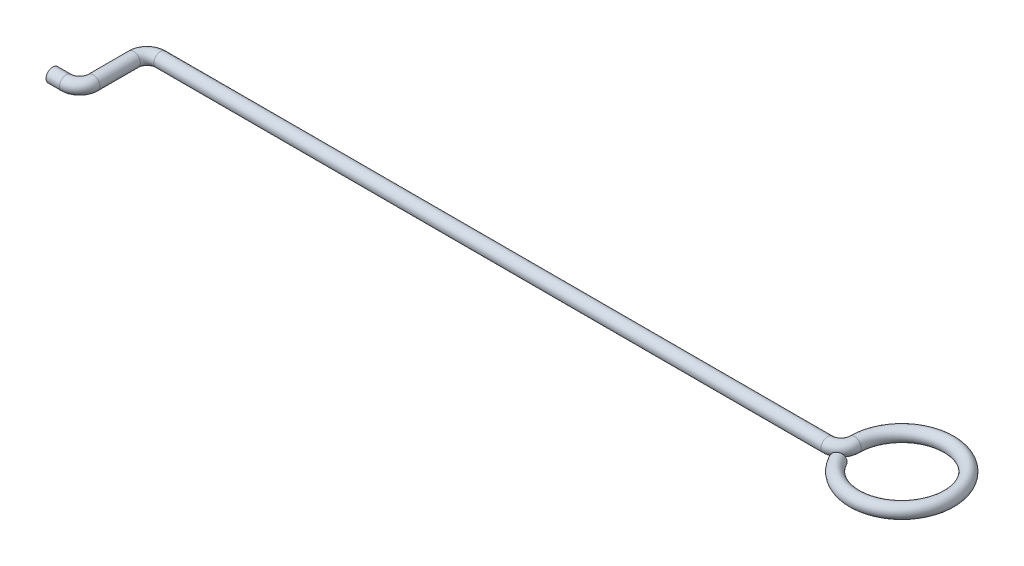
ISO-10303-21;
HEADER;
FILE_DESCRIPTION(('STEP AP214'),'2;1');
FILE_NAME('part.step','',(''),(''),'','','');
FILE_SCHEMA(('AUTOMOTIVE_DESIGN { 1 0 10303 214 1 1 1 1 }'));
ENDSEC;
DATA;
#1=APPLICATION_CONTEXT('core data for automotive mechanical design processes');
#2=APPLICATION_PROTOCOL_DEFINITION('international standard','automotive_design',2000,#1);
#3=PRODUCT_CONTEXT('',#1,'mechanical');
#4=PRODUCT('Part','Part','',(#3));
#5=PRODUCT_RELATED_PRODUCT_CATEGORY('part','',(#4));
#6=PRODUCT_DEFINITION_FORMATION('','',#4);
#7=PRODUCT_DEFINITION_CONTEXT('part definition',#1,'design');
#8=PRODUCT_DEFINITION('design','',#6,#7);
#9=PRODUCT_DEFINITION_SHAPE('','',#8);
#10=(LENGTH_UNIT() NAMED_UNIT(*) SI_UNIT(.MILLI.,.METRE.));
#11=(NAMED_UNIT(*) PLANE_ANGLE_UNIT() SI_UNIT($,.RADIAN.));
#12=(NAMED_UNIT(*) SI_UNIT($,.STERADIAN.) SOLID_ANGLE_UNIT());
#13=UNCERTAINTY_MEASURE_WITH_UNIT(LENGTH_MEASURE(1.E-05),#10,'distance_accuracy_value','');
#14=(GEOMETRIC_REPRESENTATION_CONTEXT(3) GLOBAL_UNCERTAINTY_ASSIGNED_CONTEXT((#13)) GLOBAL_UNIT_ASSIGNED_CONTEXT((#10,
#11,#12)) REPRESENTATION_CONTEXT('',''));
#15=CARTESIAN_POINT('',(0.,0.,0.));
#16=DIRECTION('',(0.,0.,1.));
#17=DIRECTION('',(1.,0.,0.));
#18=AXIS2_PLACEMENT_3D('',#15,#16,#17);
#19=CARTESIAN_POINT('',(57.,0.,-6.));
#20=DIRECTION('',(0.,-1.,0.));
#21=DIRECTION('',(0.,0.,-1.));
#22=AXIS2_PLACEMENT_3D('',#19,#20,#21);
#23=TOROIDAL_SURFACE('',#22,3.50000000000003,0.5);
#24=CARTESIAN_POINT('',(53.5,0.,-6.));
#25=DIRECTION('',(0.,0.,-1.));
#26=DIRECTION('',(-1.,0.,0.));
#27=AXIS2_PLACEMENT_3D('',#24,#25,#26);
#28=CIRCLE('',#27,0.5);
#29=CARTESIAN_POINT('',(53.,0.,-6.));
#30=VERTEX_POINT('',#29);
#31=EDGE_CURVE('E37',#30,#30,#28,.T.);
#32=CARTESIAN_POINT('',(53.9053063523168,0.,-4.36510819104454));
#33=DIRECTION('',(-0.467111945415842,0.,-0.884198185052326));
#34=DIRECTION('',(-0.884198185052326,0.,0.467111945415842));
#35=AXIS2_PLACEMENT_3D('',#32,#33,#34);
#36=CIRCLE('',#35,0.5);
#37=CARTESIAN_POINT('',(53.4632072597907,0.,-4.13155221833662));
#38=VERTEX_POINT('',#37);
#39=EDGE_CURVE('E10',#38,#38,#36,.T.);
#40=CARTESIAN_POINT('',(57.,0.,-6.));
#41=DIRECTION('',(0.,-1.,0.));
#42=DIRECTION('',(0.,0.,-1.));
#43=AXIS2_PLACEMENT_3D('',#40,#41,#42);
#44=CIRCLE('',#43,4.00000000000003);
#45=EDGE_CURVE('',#30,#38,#44,.T.);
#46=ORIENTED_EDGE('',*,*,#31,.T.);
#47=ORIENTED_EDGE('',*,*,#39,.F.);
#48=ORIENTED_EDGE('',*,*,#45,.T.);
#49=ORIENTED_EDGE('',*,*,#45,.F.);
#50=EDGE_LOOP('',(#46,#48,#47,#49));
#51=FACE_BOUND('',#50,.T.);
#52=ADVANCED_FACE('F31',(#51),#23,.T.);
#53=CARTESIAN_POINT('',(52.5,0.,-6.));
#54=DIRECTION('',(0.,1.,0.));
#55=DIRECTION('',(0.,0.,1.));
#56=AXIS2_PLACEMENT_3D('',#53,#54,#55);
#57=TOROIDAL_SURFACE('',#56,1.,0.5);
#58=CARTESIAN_POINT('',(52.5,0.,-5.));
#59=DIRECTION('',(1.,0.,0.));
#60=DIRECTION('',(0.,0.,-1.));
#61=AXIS2_PLACEMENT_3D('',#58,#59,#60);
#62=CIRCLE('',#61,0.5);
#63=CARTESIAN_POINT('',(52.5,0.,-5.5));
#64=VERTEX_POINT('',#63);
#65=EDGE_CURVE('E41',#64,#64,#62,.T.);
#66=ORIENTED_EDGE('',*,*,#65,.T.);
#67=EDGE_LOOP('',(#66));
#68=FACE_BOUND('',#67,.T.);
#69=ORIENTED_EDGE('',*,*,#31,.F.);
#70=EDGE_LOOP('',(#69));
#71=FACE_BOUND('',#70,.T.);
#72=ADVANCED_FACE('F81',(#68,#71),#57,.T.);
#73=CARTESIAN_POINT('',(3.,0.,-5.));
#74=DIRECTION('',(1.,0.,0.));
#75=DIRECTION('',(0.,0.,-1.));
#76=AXIS2_PLACEMENT_3D('',#73,#74,#75);
#77=CYLINDRICAL_SURFACE('',#76,0.5);
#78=CARTESIAN_POINT('',(3.,0.,-5.));
#79=DIRECTION('',(1.,0.,0.));
#80=DIRECTION('',(0.,0.,-1.));
#81=AXIS2_PLACEMENT_3D('',#78,#79,#80);
#82=CIRCLE('',#81,0.5);
#83=CARTESIAN_POINT('',(3.,0.,-5.5));
#84=VERTEX_POINT('',#83);
#85=EDGE_CURVE('E45',#84,#84,#82,.T.);
#86=ORIENTED_EDGE('',*,*,#85,.T.);
#87=EDGE_LOOP('',(#86));
#88=FACE_BOUND('',#87,.T.);
#89=ORIENTED_EDGE('',*,*,#65,.F.);
#90=EDGE_LOOP('',(#89));
#91=FACE_BOUND('',#90,.T.);
#92=ADVANCED_FACE('F85',(#88,#91),#77,.T.);
#93=CARTESIAN_POINT('',(3.,0.,-4.));
#94=DIRECTION('',(0.,-1.,0.));
#95=DIRECTION('',(0.,0.,-1.));
#96=AXIS2_PLACEMENT_3D('',#93,#94,#95);
#97=TOROIDAL_SURFACE('',#96,1.,0.5);
#98=CARTESIAN_POINT('',(2.,0.,-4.));
#99=DIRECTION('',(0.,0.,-1.));
#100=DIRECTION('',(-1.,0.,0.));
#101=AXIS2_PLACEMENT_3D('',#98,#99,#100);
#102=CIRCLE('',#101,0.5);
#103=CARTESIAN_POINT('',(1.5,0.,-4.));
#104=VERTEX_POINT('',#103);
#105=EDGE_CURVE('E50',#104,#104,#102,.T.);
#106=CARTESIAN_POINT('',(3.,0.,-4.));
#107=DIRECTION('',(0.,-1.,0.));
#108=DIRECTION('',(0.,0.,-1.));
#109=AXIS2_PLACEMENT_3D('',#106,#107,#108);
#110=CIRCLE('',#109,1.5);
#111=EDGE_CURVE('',#104,#84,#110,.T.);
#112=ORIENTED_EDGE('',*,*,#105,.T.);
#113=ORIENTED_EDGE('',*,*,#85,.F.);
#114=ORIENTED_EDGE('',*,*,#111,.T.);
#115=ORIENTED_EDGE('',*,*,#111,.F.);
#116=EDGE_LOOP('',(#112,#114,#113,#115));
#117=FACE_BOUND('',#116,.T.);
#118=ADVANCED_FACE('F91',(#117),#97,.T.);
#119=CARTESIAN_POINT('',(2.,0.,-1.));
#120=DIRECTION('',(0.,0.,-1.));
#121=DIRECTION('',(-1.,0.,0.));
#122=AXIS2_PLACEMENT_3D('',#119,#120,#121);
#123=CYLINDRICAL_SURFACE('',#122,0.5);
#124=CARTESIAN_POINT('',(2.,0.,-1.));
#125=DIRECTION('',(0.,0.,-1.));
#126=DIRECTION('',(-1.,0.,0.));
#127=AXIS2_PLACEMENT_3D('',#124,#125,#126);
#128=CIRCLE('',#127,0.5);
#129=CARTESIAN_POINT('',(2.5,0.,-1.));
#130=VERTEX_POINT('',#129);
#131=EDGE_CURVE('E53',#130,#130,#128,.T.);
#132=ORIENTED_EDGE('',*,*,#131,.T.);
#133=EDGE_LOOP('',(#132));
#134=FACE_BOUND('',#133,.T.);
#135=ORIENTED_EDGE('',*,*,#105,.F.);
#136=EDGE_LOOP('',(#135));
#137=FACE_BOUND('',#136,.T.);
#138=ADVANCED_FACE('F98',(#134,#137),#123,.T.);
#139=CARTESIAN_POINT('',(1.,0.,-1.));
#140=DIRECTION('',(0.,1.,0.));
#141=DIRECTION('',(0.,0.,1.));
#142=AXIS2_PLACEMENT_3D('',#139,#140,#141);
#143=TOROIDAL_SURFACE('',#142,1.,0.5);
#144=CARTESIAN_POINT('',(1.,0.,0.));
#145=DIRECTION('',(1.,0.,0.));
#146=DIRECTION('',(0.,0.,-1.));
#147=AXIS2_PLACEMENT_3D('',#144,#145,#146);
#148=CIRCLE('',#147,0.5);
#149=CARTESIAN_POINT('',(1.,0.,0.5));
#150=VERTEX_POINT('',#149);
#151=EDGE_CURVE('E56',#150,#150,#148,.T.);
#152=CARTESIAN_POINT('',(1.,0.,-1.));
#153=DIRECTION('',(0.,1.,0.));
#154=DIRECTION('',(0.,0.,1.));
#155=AXIS2_PLACEMENT_3D('',#152,#153,#154);
#156=CIRCLE('',#155,1.5);
#157=EDGE_CURVE('',#150,#130,#156,.T.);
#158=ORIENTED_EDGE('',*,*,#151,.T.);
#159=ORIENTED_EDGE('',*,*,#131,.F.);
#160=ORIENTED_EDGE('',*,*,#157,.T.);
#161=ORIENTED_EDGE('',*,*,#157,.F.);
#162=EDGE_LOOP('',(#158,#160,#159,#161));
#163=FACE_BOUND('',#162,.T.);
#164=ADVANCED_FACE('F63',(#163),#143,.T.);
#165=CARTESIAN_POINT('',(1.,0.,0.));
#166=DIRECTION('',(-1.,0.,0.));
#167=DIRECTION('',(0.,0.,1.));
#168=AXIS2_PLACEMENT_3D('',#165,#166,#167);
#169=CYLINDRICAL_SURFACE('',#168,0.5);
#170=ORIENTED_EDGE('',*,*,#151,.F.);
#171=EDGE_LOOP('',(#170));
#172=FACE_BOUND('',#171,.T.);
#173=CARTESIAN_POINT('',(0.,0.,0.));
#174=DIRECTION('',(1.,0.,0.));
#175=DIRECTION('',(0.,0.,-1.));
#176=AXIS2_PLACEMENT_3D('',#173,#174,#175);
#177=CIRCLE('',#176,0.5);
#178=CARTESIAN_POINT('',(0.,0.,-0.5));
#179=VERTEX_POINT('',#178);
#180=EDGE_CURVE('E57',#179,#179,#177,.T.);
#181=ORIENTED_EDGE('',*,*,#180,.T.);
#182=EDGE_LOOP('',(#181));
#183=FACE_BOUND('',#182,.T.);
#184=ADVANCED_FACE('F66',(#172,#183),#169,.T.);
#185=CARTESIAN_POINT('',(53.9053063523168,0.,-4.36510819104454));
#186=DIRECTION('',(-0.467111945415842,0.,-0.884198185052326));
#187=DIRECTION('',(-0.884198185052326,0.,0.467111945415842));
#188=AXIS2_PLACEMENT_3D('',#185,#186,#187);
#189=PLANE('',#188);
#190=ORIENTED_EDGE('',*,*,#39,.T.);
#191=EDGE_LOOP('',(#190));
#192=FACE_BOUND('',#191,.T.);
#193=ADVANCED_FACE('F69',(#192),#189,.T.);
#194=CARTESIAN_POINT('',(0.,0.,0.));
#195=DIRECTION('',(1.,0.,0.));
#196=DIRECTION('',(0.,0.,-1.));
#197=AXIS2_PLACEMENT_3D('',#194,#195,#196);
#198=PLANE('',#197);
#199=ORIENTED_EDGE('',*,*,#180,.F.);
#200=EDGE_LOOP('',(#199));
#201=FACE_BOUND('',#200,.T.);
#202=ADVANCED_FACE('F73',(#201),#198,.F.);
#203=CLOSED_SHELL('',(#52,#72,#92,#118,#138,#164,#184,#193,#202));
#204=MANIFOLD_SOLID_BREP('B2',#203);
#205=ADVANCED_BREP_SHAPE_REPRESENTATION('',(#18,#204),#14);
#206=SHAPE_DEFINITION_REPRESENTATION(#9,#205);
ENDSEC;
END-ISO-10303-21;
